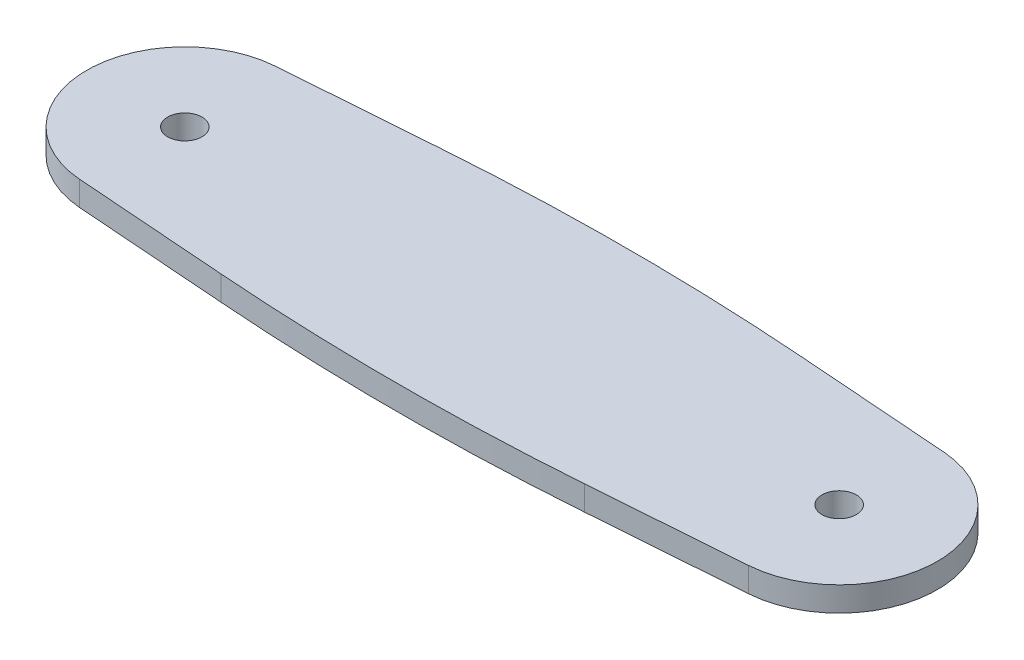
ISO-10303-21;
HEADER;
FILE_DESCRIPTION(('STEP AP214'),'2;1');
FILE_NAME('part.step','',(''),(''),'','','');
FILE_SCHEMA(('AUTOMOTIVE_DESIGN { 1 0 10303 214 1 1 1 1 }'));
ENDSEC;
DATA;
#1=APPLICATION_CONTEXT('core data for automotive mechanical design processes');
#2=APPLICATION_PROTOCOL_DEFINITION('international standard','automotive_design',2000,#1);
#3=PRODUCT_CONTEXT('',#1,'mechanical');
#4=PRODUCT('Part','Part','',(#3));
#5=PRODUCT_RELATED_PRODUCT_CATEGORY('part','',(#4));
#6=PRODUCT_DEFINITION_FORMATION('','',#4);
#7=PRODUCT_DEFINITION_CONTEXT('part definition',#1,'design');
#8=PRODUCT_DEFINITION('design','',#6,#7);
#9=PRODUCT_DEFINITION_SHAPE('','',#8);
#10=(LENGTH_UNIT() NAMED_UNIT(*) SI_UNIT(.MILLI.,.METRE.));
#11=(NAMED_UNIT(*) PLANE_ANGLE_UNIT() SI_UNIT($,.RADIAN.));
#12=(NAMED_UNIT(*) SI_UNIT($,.STERADIAN.) SOLID_ANGLE_UNIT());
#13=UNCERTAINTY_MEASURE_WITH_UNIT(LENGTH_MEASURE(1.E-05),#10,'distance_accuracy_value','');
#14=(GEOMETRIC_REPRESENTATION_CONTEXT(3) GLOBAL_UNCERTAINTY_ASSIGNED_CONTEXT((#13)) GLOBAL_UNIT_ASSIGNED_CONTEXT((#10,
#11,#12)) REPRESENTATION_CONTEXT('',''));
#15=CARTESIAN_POINT('',(0.,0.,0.));
#16=DIRECTION('',(0.,0.,1.));
#17=DIRECTION('',(1.,0.,0.));
#18=AXIS2_PLACEMENT_3D('',#15,#16,#17);
#19=CARTESIAN_POINT('',(80.,3.,0.));
#20=DIRECTION('',(0.,-1.,0.));
#21=DIRECTION('',(0.,0.,-1.));
#22=AXIS2_PLACEMENT_3D('',#19,#20,#21);
#23=PLANE('',#22);
#24=DIRECTION('',(0.997260273972603,0.,0.0739726027397259));
#25=VECTOR('',#24,1.);
#26=CARTESIAN_POINT('',(40.,3.,15.));
#27=LINE('',#26,#25);
#28=CARTESIAN_POINT('',(-0.887671232876716,3.,11.9671232876712));
#29=VERTEX_POINT('',#28);
#30=CARTESIAN_POINT('',(17.8082191780822,3.,13.353906367605));
#31=VERTEX_POINT('',#30);
#32=EDGE_CURVE('E173',#29,#31,#27,.T.);
#33=ORIENTED_EDGE('',*,*,#32,.T.);
#34=CARTESIAN_POINT('',(40.,3.,-285.824175824176));
#35=DIRECTION('',(0.,-1.,0.));
#36=DIRECTION('',(0.,0.,-1.));
#37=AXIS2_PLACEMENT_3D('',#34,#35,#36);
#38=CIRCLE('',#37,300.);
#39=CARTESIAN_POINT('',(62.1917808219178,3.,13.353906367605));
#40=VERTEX_POINT('',#39);
#41=EDGE_CURVE('E140',#31,#40,#38,.F.);
#42=ORIENTED_EDGE('',*,*,#41,.T.);
#43=DIRECTION('',(0.997260273972603,0.,-0.0739726027397261));
#44=VECTOR('',#43,1.);
#45=CARTESIAN_POINT('',(80.8876712328767,3.,11.9671232876712));
#46=LINE('',#45,#44);
#47=CARTESIAN_POINT('',(80.8876712328767,3.,11.9671232876712));
#48=VERTEX_POINT('',#47);
#49=EDGE_CURVE('E114',#40,#48,#46,.T.);
#50=ORIENTED_EDGE('',*,*,#49,.T.);
#51=CARTESIAN_POINT('',(80.,3.,0.));
#52=DIRECTION('',(0.,1.,0.));
#53=DIRECTION('',(0.,0.,-1.));
#54=AXIS2_PLACEMENT_3D('',#51,#52,#53);
#55=CIRCLE('',#54,12.);
#56=CARTESIAN_POINT('',(80.8876712328767,3.,-11.9671232876712));
#57=VERTEX_POINT('',#56);
#58=EDGE_CURVE('E108',#48,#57,#55,.T.);
#59=ORIENTED_EDGE('',*,*,#58,.T.);
#60=DIRECTION('',(-0.997260273972603,0.,-0.0739726027397261));
#61=VECTOR('',#60,1.);
#62=CARTESIAN_POINT('',(40.,3.,-15.));
#63=LINE('',#62,#61);
#64=CARTESIAN_POINT('',(62.1917808219178,3.,-13.353906367605));
#65=VERTEX_POINT('',#64);
#66=EDGE_CURVE('E101',#57,#65,#63,.T.);
#67=ORIENTED_EDGE('',*,*,#66,.T.);
#68=CARTESIAN_POINT('',(40.,3.,285.824175824176));
#69=DIRECTION('',(0.,-1.,0.));
#70=DIRECTION('',(0.,0.,-1.));
#71=AXIS2_PLACEMENT_3D('',#68,#69,#70);
#72=CIRCLE('',#71,300.);
#73=CARTESIAN_POINT('',(17.8082191780822,3.,-13.353906367605));
#74=VERTEX_POINT('',#73);
#75=EDGE_CURVE('E54',#65,#74,#72,.F.);
#76=ORIENTED_EDGE('',*,*,#75,.T.);
#77=DIRECTION('',(-0.997260273972603,0.,0.0739726027397259));
#78=VECTOR('',#77,1.);
#79=CARTESIAN_POINT('',(-0.887671232876712,3.,-11.9671232876712));
#80=LINE('',#79,#78);
#81=CARTESIAN_POINT('',(-0.887671232876712,3.,-11.9671232876712));
#82=VERTEX_POINT('',#81);
#83=EDGE_CURVE('E107',#74,#82,#80,.T.);
#84=ORIENTED_EDGE('',*,*,#83,.T.);
#85=CARTESIAN_POINT('',(0.,3.,0.));
#86=DIRECTION('',(0.,1.,0.));
#87=DIRECTION('',(0.,0.,1.));
#88=AXIS2_PLACEMENT_3D('',#85,#86,#87);
#89=CIRCLE('',#88,12.);
#90=EDGE_CURVE('E183',#82,#29,#89,.T.);
#91=ORIENTED_EDGE('',*,*,#90,.T.);
#92=EDGE_LOOP('',(#33,#42,#50,#59,#67,#76,#84,#91));
#93=FACE_BOUND('',#92,.T.);
#94=CARTESIAN_POINT('',(0.,3.,0.));
#95=DIRECTION('',(0.,1.,0.));
#96=DIRECTION('',(0.,0.,1.));
#97=AXIS2_PLACEMENT_3D('',#94,#95,#96);
#98=CIRCLE('',#97,2.1);
#99=CARTESIAN_POINT('',(0.,3.,2.1));
#100=VERTEX_POINT('',#99);
#101=EDGE_CURVE('E186',#100,#100,#98,.T.);
#102=ORIENTED_EDGE('',*,*,#101,.F.);
#103=EDGE_LOOP('',(#102));
#104=FACE_BOUND('',#103,.T.);
#105=CARTESIAN_POINT('',(80.,3.,0.));
#106=DIRECTION('',(0.,1.,0.));
#107=DIRECTION('',(0.,0.,1.));
#108=AXIS2_PLACEMENT_3D('',#105,#106,#107);
#109=CIRCLE('',#108,2.1);
#110=CARTESIAN_POINT('',(80.,3.,2.09999999999999));
#111=VERTEX_POINT('',#110);
#112=EDGE_CURVE('E193',#111,#111,#109,.T.);
#113=ORIENTED_EDGE('',*,*,#112,.F.);
#114=EDGE_LOOP('',(#113));
#115=FACE_BOUND('',#114,.T.);
#116=ADVANCED_FACE('F39',(#93,#104,#115),#23,.F.);
#117=CARTESIAN_POINT('',(80.,0.,0.));
#118=DIRECTION('',(0.,-1.,0.));
#119=DIRECTION('',(0.,0.,-1.));
#120=AXIS2_PLACEMENT_3D('',#117,#118,#119);
#121=PLANE('',#120);
#122=CARTESIAN_POINT('',(0.,0.,0.));
#123=DIRECTION('',(0.,1.,0.));
#124=DIRECTION('',(0.,0.,1.));
#125=AXIS2_PLACEMENT_3D('',#122,#123,#124);
#126=CIRCLE('',#125,2.1);
#127=CARTESIAN_POINT('',(0.,0.,2.1));
#128=VERTEX_POINT('',#127);
#129=EDGE_CURVE('E188',#128,#128,#126,.T.);
#130=ORIENTED_EDGE('',*,*,#129,.T.);
#131=EDGE_LOOP('',(#130));
#132=FACE_BOUND('',#131,.T.);
#133=DIRECTION('',(0.997260273972603,0.,-0.0739726027397261));
#134=VECTOR('',#133,1.);
#135=CARTESIAN_POINT('',(80.8876712328767,0.,11.9671232876712));
#136=LINE('',#135,#134);
#137=CARTESIAN_POINT('',(62.1917808219178,0.,13.353906367605));
#138=VERTEX_POINT('',#137);
#139=CARTESIAN_POINT('',(80.8876712328767,0.,11.9671232876712));
#140=VERTEX_POINT('',#139);
#141=EDGE_CURVE('E118',#138,#140,#136,.T.);
#142=ORIENTED_EDGE('',*,*,#141,.F.);
#143=CARTESIAN_POINT('',(40.,0.,-285.824175824176));
#144=DIRECTION('',(0.,-1.,0.));
#145=DIRECTION('',(0.,0.,-1.));
#146=AXIS2_PLACEMENT_3D('',#143,#144,#145);
#147=CIRCLE('',#146,300.);
#148=CARTESIAN_POINT('',(17.8082191780822,0.,13.353906367605));
#149=VERTEX_POINT('',#148);
#150=EDGE_CURVE('E135',#138,#149,#147,.T.);
#151=ORIENTED_EDGE('',*,*,#150,.T.);
#152=DIRECTION('',(0.997260273972603,0.,0.0739726027397259));
#153=VECTOR('',#152,1.);
#154=CARTESIAN_POINT('',(40.,0.,15.));
#155=LINE('',#154,#153);
#156=CARTESIAN_POINT('',(-0.887671232876716,0.,11.9671232876712));
#157=VERTEX_POINT('',#156);
#158=EDGE_CURVE('E158',#157,#149,#155,.T.);
#159=ORIENTED_EDGE('',*,*,#158,.F.);
#160=CARTESIAN_POINT('',(0.,0.,0.));
#161=DIRECTION('',(0.,1.,0.));
#162=DIRECTION('',(0.,0.,1.));
#163=AXIS2_PLACEMENT_3D('',#160,#161,#162);
#164=CIRCLE('',#163,12.);
#165=CARTESIAN_POINT('',(-0.887671232876712,0.,-11.9671232876712));
#166=VERTEX_POINT('',#165);
#167=EDGE_CURVE('E155',#166,#157,#164,.T.);
#168=ORIENTED_EDGE('',*,*,#167,.F.);
#169=DIRECTION('',(-0.997260273972603,0.,0.0739726027397259));
#170=VECTOR('',#169,1.);
#171=CARTESIAN_POINT('',(-0.887671232876712,0.,-11.9671232876712));
#172=LINE('',#171,#170);
#173=CARTESIAN_POINT('',(17.8082191780822,0.,-13.353906367605));
#174=VERTEX_POINT('',#173);
#175=EDGE_CURVE('E147',#174,#166,#172,.T.);
#176=ORIENTED_EDGE('',*,*,#175,.F.);
#177=CARTESIAN_POINT('',(40.,0.,285.824175824176));
#178=DIRECTION('',(0.,-1.,0.));
#179=DIRECTION('',(0.,0.,-1.));
#180=AXIS2_PLACEMENT_3D('',#177,#178,#179);
#181=CIRCLE('',#180,300.);
#182=CARTESIAN_POINT('',(62.1917808219178,0.,-13.353906367605));
#183=VERTEX_POINT('',#182);
#184=EDGE_CURVE('E127',#174,#183,#181,.T.);
#185=ORIENTED_EDGE('',*,*,#184,.T.);
#186=DIRECTION('',(-0.997260273972603,0.,-0.0739726027397261));
#187=VECTOR('',#186,1.);
#188=CARTESIAN_POINT('',(40.,0.,-15.));
#189=LINE('',#188,#187);
#190=CARTESIAN_POINT('',(80.8876712328767,0.,-11.9671232876712));
#191=VERTEX_POINT('',#190);
#192=EDGE_CURVE('E156',#191,#183,#189,.T.);
#193=ORIENTED_EDGE('',*,*,#192,.F.);
#194=CARTESIAN_POINT('',(80.,0.,0.));
#195=DIRECTION('',(0.,1.,0.));
#196=DIRECTION('',(0.,0.,-1.));
#197=AXIS2_PLACEMENT_3D('',#194,#195,#196);
#198=CIRCLE('',#197,12.);
#199=EDGE_CURVE('E122',#140,#191,#198,.T.);
#200=ORIENTED_EDGE('',*,*,#199,.F.);
#201=EDGE_LOOP('',(#142,#151,#159,#168,#176,#185,#193,#200));
#202=FACE_BOUND('',#201,.T.);
#203=CARTESIAN_POINT('',(80.,0.,0.));
#204=DIRECTION('',(0.,1.,0.));
#205=DIRECTION('',(0.,0.,1.));
#206=AXIS2_PLACEMENT_3D('',#203,#204,#205);
#207=CIRCLE('',#206,2.1);
#208=CARTESIAN_POINT('',(80.,0.,2.09999999999999));
#209=VERTEX_POINT('',#208);
#210=EDGE_CURVE('E196',#209,#209,#207,.T.);
#211=ORIENTED_EDGE('',*,*,#210,.T.);
#212=EDGE_LOOP('',(#211));
#213=FACE_BOUND('',#212,.T.);
#214=ADVANCED_FACE('F152',(#132,#202,#213),#121,.T.);
#215=CARTESIAN_POINT('',(80.,3.,0.));
#216=DIRECTION('',(0.,-1.,0.));
#217=DIRECTION('',(0.,0.,-1.));
#218=AXIS2_PLACEMENT_3D('',#215,#216,#217);
#219=CYLINDRICAL_SURFACE('',#218,12.);
#220=ORIENTED_EDGE('',*,*,#199,.T.);
#221=DIRECTION('',(0.,-1.,0.));
#222=VECTOR('',#221,1.);
#223=CARTESIAN_POINT('',(80.8876712328767,3.,-11.9671232876712));
#224=LINE('',#223,#222);
#225=EDGE_CURVE('E105',#57,#191,#224,.T.);
#226=ORIENTED_EDGE('',*,*,#225,.F.);
#227=ORIENTED_EDGE('',*,*,#58,.F.);
#228=DIRECTION('',(0.,-1.,0.));
#229=VECTOR('',#228,1.);
#230=CARTESIAN_POINT('',(80.8876712328767,3.,11.9671232876712));
#231=LINE('',#230,#229);
#232=EDGE_CURVE('E166',#48,#140,#231,.T.);
#233=ORIENTED_EDGE('',*,*,#232,.T.);
#234=EDGE_LOOP('',(#220,#226,#227,#233));
#235=FACE_BOUND('',#234,.T.);
#236=ADVANCED_FACE('F120',(#235),#219,.T.);
#237=CARTESIAN_POINT('',(40.,3.,-15.));
#238=DIRECTION('',(-0.0739726027397261,0.,0.997260273972603));
#239=DIRECTION('',(0.997260273972603,0.,0.0739726027397261));
#240=AXIS2_PLACEMENT_3D('',#237,#238,#239);
#241=PLANE('',#240);
#242=ORIENTED_EDGE('',*,*,#192,.T.);
#243=DIRECTION('',(0.,-1.,0.));
#244=VECTOR('',#243,1.);
#245=CARTESIAN_POINT('',(62.1917808219178,3.,-13.353906367605));
#246=LINE('',#245,#244);
#247=EDGE_CURVE('E11',#183,#65,#246,.F.);
#248=ORIENTED_EDGE('',*,*,#247,.T.);
#249=ORIENTED_EDGE('',*,*,#66,.F.);
#250=ORIENTED_EDGE('',*,*,#225,.T.);
#251=EDGE_LOOP('',(#242,#248,#249,#250));
#252=FACE_BOUND('',#251,.T.);
#253=ADVANCED_FACE('F103',(#252),#241,.F.);
#254=CARTESIAN_POINT('',(-0.887671232876712,3.,-11.9671232876712));
#255=DIRECTION('',(0.0739726027397259,0.,0.997260273972603));
#256=DIRECTION('',(0.997260273972603,0.,-0.0739726027397259));
#257=AXIS2_PLACEMENT_3D('',#254,#255,#256);
#258=PLANE('',#257);
#259=ORIENTED_EDGE('',*,*,#83,.F.);
#260=DIRECTION('',(0.,-1.,0.));
#261=VECTOR('',#260,1.);
#262=CARTESIAN_POINT('',(17.8082191780822,3.,-13.353906367605));
#263=LINE('',#262,#261);
#264=EDGE_CURVE('E47',#74,#174,#263,.T.);
#265=ORIENTED_EDGE('',*,*,#264,.T.);
#266=ORIENTED_EDGE('',*,*,#175,.T.);
#267=DIRECTION('',(0.,-1.,0.));
#268=VECTOR('',#267,1.);
#269=CARTESIAN_POINT('',(-0.887671232876712,3.,-11.9671232876712));
#270=LINE('',#269,#268);
#271=EDGE_CURVE('E124',#82,#166,#270,.T.);
#272=ORIENTED_EDGE('',*,*,#271,.F.);
#273=EDGE_LOOP('',(#259,#265,#266,#272));
#274=FACE_BOUND('',#273,.T.);
#275=ADVANCED_FACE('F145',(#274),#258,.F.);
#276=CARTESIAN_POINT('',(0.,3.,0.));
#277=DIRECTION('',(0.,-1.,0.));
#278=DIRECTION('',(0.,0.,-1.));
#279=AXIS2_PLACEMENT_3D('',#276,#277,#278);
#280=CYLINDRICAL_SURFACE('',#279,12.);
#281=ORIENTED_EDGE('',*,*,#167,.T.);
#282=DIRECTION('',(0.,-1.,0.));
#283=VECTOR('',#282,1.);
#284=CARTESIAN_POINT('',(-0.887671232876716,3.,11.9671232876712));
#285=LINE('',#284,#283);
#286=EDGE_CURVE('E130',#29,#157,#285,.T.);
#287=ORIENTED_EDGE('',*,*,#286,.F.);
#288=ORIENTED_EDGE('',*,*,#90,.F.);
#289=ORIENTED_EDGE('',*,*,#271,.T.);
#290=EDGE_LOOP('',(#281,#287,#288,#289));
#291=FACE_BOUND('',#290,.T.);
#292=ADVANCED_FACE('F199',(#291),#280,.T.);
#293=CARTESIAN_POINT('',(40.,3.,15.));
#294=DIRECTION('',(0.0739726027397259,0.,-0.997260273972603));
#295=DIRECTION('',(-0.997260273972603,0.,-0.0739726027397259));
#296=AXIS2_PLACEMENT_3D('',#293,#294,#295);
#297=PLANE('',#296);
#298=ORIENTED_EDGE('',*,*,#158,.T.);
#299=DIRECTION('',(0.,-1.,0.));
#300=VECTOR('',#299,1.);
#301=CARTESIAN_POINT('',(17.8082191780822,3.,13.353906367605));
#302=LINE('',#301,#300);
#303=EDGE_CURVE('E137',#149,#31,#302,.F.);
#304=ORIENTED_EDGE('',*,*,#303,.T.);
#305=ORIENTED_EDGE('',*,*,#32,.F.);
#306=ORIENTED_EDGE('',*,*,#286,.T.);
#307=EDGE_LOOP('',(#298,#304,#305,#306));
#308=FACE_BOUND('',#307,.T.);
#309=ADVANCED_FACE('F171',(#308),#297,.F.);
#310=CARTESIAN_POINT('',(80.8876712328767,3.,11.9671232876712));
#311=DIRECTION('',(-0.0739726027397261,0.,-0.997260273972603));
#312=DIRECTION('',(-0.997260273972603,0.,0.0739726027397261));
#313=AXIS2_PLACEMENT_3D('',#310,#311,#312);
#314=PLANE('',#313);
#315=ORIENTED_EDGE('',*,*,#49,.F.);
#316=DIRECTION('',(0.,-1.,0.));
#317=VECTOR('',#316,1.);
#318=CARTESIAN_POINT('',(62.1917808219178,3.,13.353906367605));
#319=LINE('',#318,#317);
#320=EDGE_CURVE('E123',#40,#138,#319,.T.);
#321=ORIENTED_EDGE('',*,*,#320,.T.);
#322=ORIENTED_EDGE('',*,*,#141,.T.);
#323=ORIENTED_EDGE('',*,*,#232,.F.);
#324=EDGE_LOOP('',(#315,#321,#322,#323));
#325=FACE_BOUND('',#324,.T.);
#326=ADVANCED_FACE('F181',(#325),#314,.F.);
#327=CARTESIAN_POINT('',(0.,3.,0.));
#328=DIRECTION('',(0.,-1.,0.));
#329=DIRECTION('',(0.,0.,-1.));
#330=AXIS2_PLACEMENT_3D('',#327,#328,#329);
#331=CYLINDRICAL_SURFACE('',#330,2.1);
#332=ORIENTED_EDGE('',*,*,#101,.T.);
#333=EDGE_LOOP('',(#332));
#334=FACE_BOUND('',#333,.T.);
#335=ORIENTED_EDGE('',*,*,#129,.F.);
#336=EDGE_LOOP('',(#335));
#337=FACE_BOUND('',#336,.T.);
#338=ADVANCED_FACE('F216',(#334,#337),#331,.F.);
#339=CARTESIAN_POINT('',(80.,3.,0.));
#340=DIRECTION('',(0.,-1.,0.));
#341=DIRECTION('',(0.,0.,-1.));
#342=AXIS2_PLACEMENT_3D('',#339,#340,#341);
#343=CYLINDRICAL_SURFACE('',#342,2.1);
#344=ORIENTED_EDGE('',*,*,#112,.T.);
#345=EDGE_LOOP('',(#344));
#346=FACE_BOUND('',#345,.T.);
#347=ORIENTED_EDGE('',*,*,#210,.F.);
#348=EDGE_LOOP('',(#347));
#349=FACE_BOUND('',#348,.T.);
#350=ADVANCED_FACE('F223',(#346,#349),#343,.F.);
#351=CARTESIAN_POINT('',(40.,3.,-285.824175824176));
#352=DIRECTION('',(0.,-1.,0.));
#353=DIRECTION('',(0.,0.,-1.));
#354=AXIS2_PLACEMENT_3D('',#351,#352,#353);
#355=CYLINDRICAL_SURFACE('',#354,300.);
#356=ORIENTED_EDGE('',*,*,#41,.F.);
#357=ORIENTED_EDGE('',*,*,#303,.F.);
#358=ORIENTED_EDGE('',*,*,#150,.F.);
#359=ORIENTED_EDGE('',*,*,#320,.F.);
#360=EDGE_LOOP('',(#356,#357,#358,#359));
#361=FACE_BOUND('',#360,.T.);
#362=ADVANCED_FACE('F179',(#361),#355,.T.);
#363=CARTESIAN_POINT('',(40.,3.,285.824175824176));
#364=DIRECTION('',(0.,-1.,0.));
#365=DIRECTION('',(0.,0.,-1.));
#366=AXIS2_PLACEMENT_3D('',#363,#364,#365);
#367=CYLINDRICAL_SURFACE('',#366,300.);
#368=ORIENTED_EDGE('',*,*,#75,.F.);
#369=ORIENTED_EDGE('',*,*,#247,.F.);
#370=ORIENTED_EDGE('',*,*,#184,.F.);
#371=ORIENTED_EDGE('',*,*,#264,.F.);
#372=EDGE_LOOP('',(#368,#369,#370,#371));
#373=FACE_BOUND('',#372,.T.);
#374=ADVANCED_FACE('F41',(#373),#367,.T.);
#375=CLOSED_SHELL('',(#116,#214,#236,#253,#275,#292,#309,#326,#338,#350,#362,#374));
#376=MANIFOLD_SOLID_BREP('B2',#375);
#377=ADVANCED_BREP_SHAPE_REPRESENTATION('',(#18,#376),#14);
#378=SHAPE_DEFINITION_REPRESENTATION(#9,#377);
ENDSEC;
END-ISO-10303-21;
